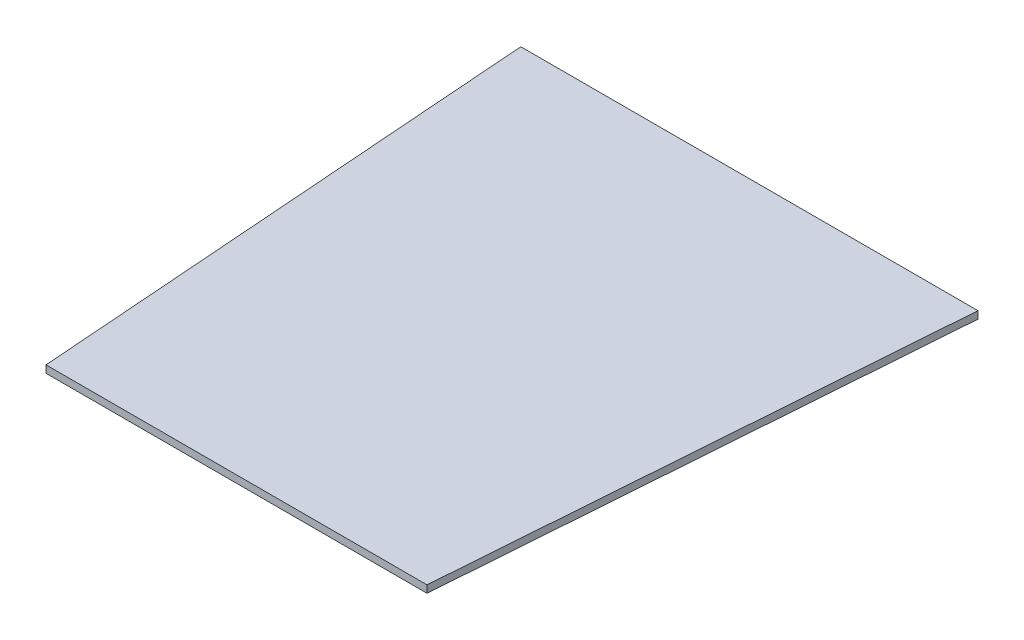
ISO-10303-21;
HEADER;
FILE_DESCRIPTION(('STEP AP214'),'2;1');
FILE_NAME('part.step','',(''),(''),'','','');
FILE_SCHEMA(('AUTOMOTIVE_DESIGN { 1 0 10303 214 1 1 1 1 }'));
ENDSEC;
DATA;
#1=APPLICATION_CONTEXT('core data for automotive mechanical design processes');
#2=APPLICATION_PROTOCOL_DEFINITION('international standard','automotive_design',2000,#1);
#3=PRODUCT_CONTEXT('',#1,'mechanical');
#4=PRODUCT('Part','Part','',(#3));
#5=PRODUCT_RELATED_PRODUCT_CATEGORY('part','',(#4));
#6=PRODUCT_DEFINITION_FORMATION('','',#4);
#7=PRODUCT_DEFINITION_CONTEXT('part definition',#1,'design');
#8=PRODUCT_DEFINITION('design','',#6,#7);
#9=PRODUCT_DEFINITION_SHAPE('','',#8);
#10=(LENGTH_UNIT() NAMED_UNIT(*) SI_UNIT(.MILLI.,.METRE.));
#11=(NAMED_UNIT(*) PLANE_ANGLE_UNIT() SI_UNIT($,.RADIAN.));
#12=(NAMED_UNIT(*) SI_UNIT($,.STERADIAN.) SOLID_ANGLE_UNIT());
#13=UNCERTAINTY_MEASURE_WITH_UNIT(LENGTH_MEASURE(1.E-05),#10,'distance_accuracy_value','');
#14=(GEOMETRIC_REPRESENTATION_CONTEXT(3) GLOBAL_UNCERTAINTY_ASSIGNED_CONTEXT((#13)) GLOBAL_UNIT_ASSIGNED_CONTEXT((#10,
#11,#12)) REPRESENTATION_CONTEXT('',''));
#15=CARTESIAN_POINT('',(0.,0.,0.));
#16=DIRECTION('',(0.,0.,1.));
#17=DIRECTION('',(1.,0.,0.));
#18=AXIS2_PLACEMENT_3D('',#15,#16,#17);
#19=CARTESIAN_POINT('',(-156.,5.,-175.));
#20=DIRECTION('',(0.,0.,1.));
#21=DIRECTION('',(1.,0.,0.));
#22=AXIS2_PLACEMENT_3D('',#19,#20,#21);
#23=PLANE('',#22);
#24=DIRECTION('',(-1.,0.,0.));
#25=VECTOR('',#24,1.);
#26=CARTESIAN_POINT('',(-156.,0.,-175.));
#27=LINE('',#26,#25);
#28=CARTESIAN_POINT('',(156.,0.,-175.));
#29=VERTEX_POINT('',#28);
#30=CARTESIAN_POINT('',(-156.,0.,-175.));
#31=VERTEX_POINT('',#30);
#32=EDGE_CURVE('E96',#29,#31,#27,.T.);
#33=ORIENTED_EDGE('',*,*,#32,.T.);
#34=DIRECTION('',(0.,-1.,0.));
#35=VECTOR('',#34,1.);
#36=CARTESIAN_POINT('',(-156.,5.,-175.));
#37=LINE('',#36,#35);
#38=CARTESIAN_POINT('',(-156.,5.,-175.));
#39=VERTEX_POINT('',#38);
#40=EDGE_CURVE('E45',#39,#31,#37,.T.);
#41=ORIENTED_EDGE('',*,*,#40,.F.);
#42=DIRECTION('',(-1.,0.,0.));
#43=VECTOR('',#42,1.);
#44=CARTESIAN_POINT('',(-156.,5.,-175.));
#45=LINE('',#44,#43);
#46=CARTESIAN_POINT('',(156.,5.,-175.));
#47=VERTEX_POINT('',#46);
#48=EDGE_CURVE('E87',#47,#39,#45,.T.);
#49=ORIENTED_EDGE('',*,*,#48,.F.);
#50=DIRECTION('',(0.,-1.,0.));
#51=VECTOR('',#50,1.);
#52=CARTESIAN_POINT('',(156.,5.,-175.));
#53=LINE('',#52,#51);
#54=EDGE_CURVE('E11',#47,#29,#53,.T.);
#55=ORIENTED_EDGE('',*,*,#54,.T.);
#56=EDGE_LOOP('',(#33,#41,#49,#55));
#57=FACE_BOUND('',#56,.T.);
#58=ADVANCED_FACE('F38',(#57),#23,.F.);
#59=CARTESIAN_POINT('',(-156.,5.,175.));
#60=DIRECTION('',(0.,0.,-1.));
#61=DIRECTION('',(-1.,0.,0.));
#62=AXIS2_PLACEMENT_3D('',#59,#60,#61);
#63=PLANE('',#62);
#64=DIRECTION('',(1.,0.,0.));
#65=VECTOR('',#64,1.);
#66=CARTESIAN_POINT('',(-156.,0.,175.));
#67=LINE('',#66,#65);
#68=CARTESIAN_POINT('',(-130.,0.,175.));
#69=VERTEX_POINT('',#68);
#70=CARTESIAN_POINT('',(130.,0.,175.));
#71=VERTEX_POINT('',#70);
#72=EDGE_CURVE('E92',#69,#71,#67,.T.);
#73=ORIENTED_EDGE('',*,*,#72,.T.);
#74=DIRECTION('',(0.,1.,0.));
#75=VECTOR('',#74,1.);
#76=CARTESIAN_POINT('',(130.,0.,175.));
#77=LINE('',#76,#75);
#78=CARTESIAN_POINT('',(130.,5.,175.));
#79=VERTEX_POINT('',#78);
#80=EDGE_CURVE('E52',#71,#79,#77,.T.);
#81=ORIENTED_EDGE('',*,*,#80,.T.);
#82=DIRECTION('',(1.,0.,0.));
#83=VECTOR('',#82,1.);
#84=CARTESIAN_POINT('',(-156.,5.,175.));
#85=LINE('',#84,#83);
#86=CARTESIAN_POINT('',(-130.,5.,175.));
#87=VERTEX_POINT('',#86);
#88=EDGE_CURVE('E89',#87,#79,#85,.T.);
#89=ORIENTED_EDGE('',*,*,#88,.F.);
#90=DIRECTION('',(0.,1.,0.));
#91=VECTOR('',#90,1.);
#92=CARTESIAN_POINT('',(-130.,0.,175.));
#93=LINE('',#92,#91);
#94=EDGE_CURVE('E90',#69,#87,#93,.T.);
#95=ORIENTED_EDGE('',*,*,#94,.F.);
#96=EDGE_LOOP('',(#73,#81,#89,#95));
#97=FACE_BOUND('',#96,.T.);
#98=ADVANCED_FACE('F109',(#97),#63,.F.);
#99=CARTESIAN_POINT('',(0.,5.,0.));
#100=DIRECTION('',(0.,-1.,0.));
#101=DIRECTION('',(0.,0.,-1.));
#102=AXIS2_PLACEMENT_3D('',#99,#100,#101);
#103=PLANE('',#102);
#104=ORIENTED_EDGE('',*,*,#88,.T.);
#105=DIRECTION('',(-0.0740815907895776,0.,0.99725218370585));
#106=VECTOR('',#105,1.);
#107=CARTESIAN_POINT('',(142.21520426057,5.,10.5645580307852));
#108=LINE('',#107,#106);
#109=EDGE_CURVE('E76',#47,#79,#108,.T.);
#110=ORIENTED_EDGE('',*,*,#109,.F.);
#111=ORIENTED_EDGE('',*,*,#48,.T.);
#112=DIRECTION('',(-0.0740815907895773,0.,-0.99725218370585));
#113=VECTOR('',#112,1.);
#114=CARTESIAN_POINT('',(-142.21520426057,5.,10.5645580307852));
#115=LINE('',#114,#113);
#116=EDGE_CURVE('E106',#87,#39,#115,.T.);
#117=ORIENTED_EDGE('',*,*,#116,.F.);
#118=EDGE_LOOP('',(#104,#110,#111,#117));
#119=FACE_BOUND('',#118,.T.);
#120=ADVANCED_FACE('F85',(#119),#103,.F.);
#121=CARTESIAN_POINT('',(0.,0.,0.));
#122=DIRECTION('',(0.,-1.,0.));
#123=DIRECTION('',(0.,0.,-1.));
#124=AXIS2_PLACEMENT_3D('',#121,#122,#123);
#125=PLANE('',#124);
#126=DIRECTION('',(-0.0740815907895776,0.,0.99725218370585));
#127=VECTOR('',#126,1.);
#128=CARTESIAN_POINT('',(142.21520426057,0.,10.5645580307852));
#129=LINE('',#128,#127);
#130=EDGE_CURVE('E77',#29,#71,#129,.T.);
#131=ORIENTED_EDGE('',*,*,#130,.T.);
#132=ORIENTED_EDGE('',*,*,#72,.F.);
#133=DIRECTION('',(-0.0740815907895773,0.,-0.99725218370585));
#134=VECTOR('',#133,1.);
#135=CARTESIAN_POINT('',(-142.21520426057,0.,10.5645580307852));
#136=LINE('',#135,#134);
#137=EDGE_CURVE('E105',#69,#31,#136,.T.);
#138=ORIENTED_EDGE('',*,*,#137,.T.);
#139=ORIENTED_EDGE('',*,*,#32,.F.);
#140=EDGE_LOOP('',(#131,#132,#138,#139));
#141=FACE_BOUND('',#140,.T.);
#142=ADVANCED_FACE('F112',(#141),#125,.T.);
#143=CARTESIAN_POINT('',(-142.21520426057,0.,10.5645580307852));
#144=DIRECTION('',(0.997252183705849,0.,-0.0740815907895772));
#145=DIRECTION('',(-0.0740815907895772,0.,-0.99725218370585));
#146=AXIS2_PLACEMENT_3D('',#143,#144,#145);
#147=PLANE('',#146);
#148=ORIENTED_EDGE('',*,*,#116,.T.);
#149=ORIENTED_EDGE('',*,*,#40,.T.);
#150=ORIENTED_EDGE('',*,*,#137,.F.);
#151=ORIENTED_EDGE('',*,*,#94,.T.);
#152=EDGE_LOOP('',(#148,#149,#150,#151));
#153=FACE_BOUND('',#152,.T.);
#154=ADVANCED_FACE('F107',(#153),#147,.F.);
#155=CARTESIAN_POINT('',(142.21520426057,0.,10.5645580307852));
#156=DIRECTION('',(-0.997252183705849,0.,-0.0740815907895775));
#157=DIRECTION('',(-0.0740815907895776,0.,0.99725218370585));
#158=AXIS2_PLACEMENT_3D('',#155,#156,#157);
#159=PLANE('',#158);
#160=ORIENTED_EDGE('',*,*,#109,.T.);
#161=ORIENTED_EDGE('',*,*,#80,.F.);
#162=ORIENTED_EDGE('',*,*,#130,.F.);
#163=ORIENTED_EDGE('',*,*,#54,.F.);
#164=EDGE_LOOP('',(#160,#161,#162,#163));
#165=FACE_BOUND('',#164,.T.);
#166=ADVANCED_FACE('F75',(#165),#159,.F.);
#167=CLOSED_SHELL('',(#58,#98,#120,#142,#154,#166));
#168=MANIFOLD_SOLID_BREP('B2',#167);
#169=ADVANCED_BREP_SHAPE_REPRESENTATION('',(#18,#168),#14);
#170=SHAPE_DEFINITION_REPRESENTATION(#9,#169);
ENDSEC;
END-ISO-10303-21;
